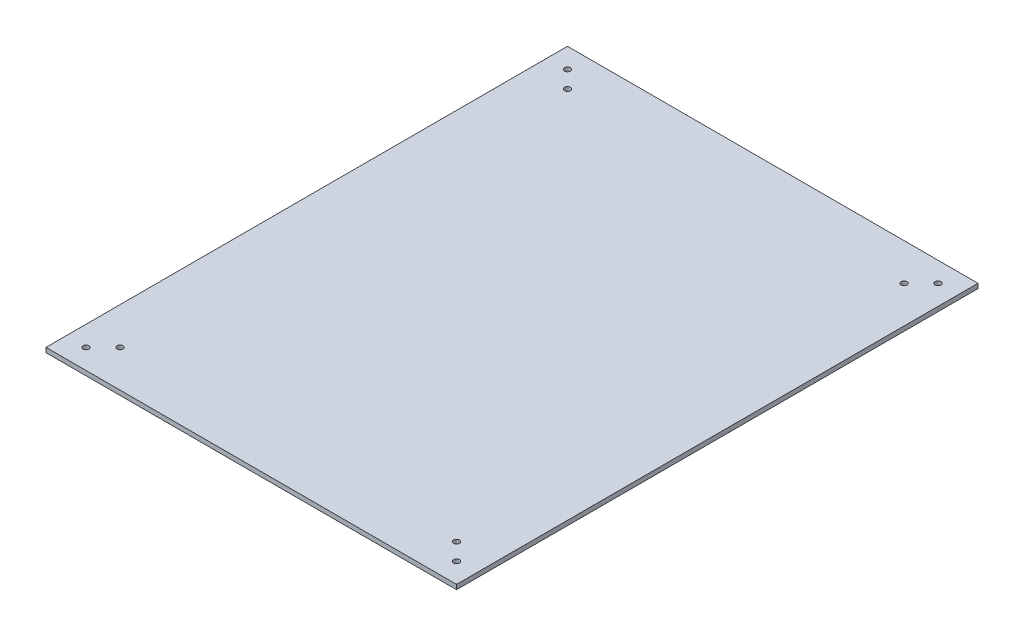
ISO-10303-21;
HEADER;
FILE_DESCRIPTION(('STEP AP214'),'2;1');
FILE_NAME('part.step','',(''),(''),'','','');
FILE_SCHEMA(('AUTOMOTIVE_DESIGN { 1 0 10303 214 1 1 1 1 }'));
ENDSEC;
DATA;
#1=APPLICATION_CONTEXT('core data for automotive mechanical design processes');
#2=APPLICATION_PROTOCOL_DEFINITION('international standard','automotive_design',2000,#1);
#3=PRODUCT_CONTEXT('',#1,'mechanical');
#4=PRODUCT('Part','Part','',(#3));
#5=PRODUCT_RELATED_PRODUCT_CATEGORY('part','',(#4));
#6=PRODUCT_DEFINITION_FORMATION('','',#4);
#7=PRODUCT_DEFINITION_CONTEXT('part definition',#1,'design');
#8=PRODUCT_DEFINITION('design','',#6,#7);
#9=PRODUCT_DEFINITION_SHAPE('','',#8);
#10=(LENGTH_UNIT() NAMED_UNIT(*) SI_UNIT(.MILLI.,.METRE.));
#11=(NAMED_UNIT(*) PLANE_ANGLE_UNIT() SI_UNIT($,.RADIAN.));
#12=(NAMED_UNIT(*) SI_UNIT($,.STERADIAN.) SOLID_ANGLE_UNIT());
#13=UNCERTAINTY_MEASURE_WITH_UNIT(LENGTH_MEASURE(1.E-05),#10,'distance_accuracy_value','');
#14=(GEOMETRIC_REPRESENTATION_CONTEXT(3) GLOBAL_UNCERTAINTY_ASSIGNED_CONTEXT((#13)) GLOBAL_UNIT_ASSIGNED_CONTEXT((#10,
#11,#12)) REPRESENTATION_CONTEXT('',''));
#15=CARTESIAN_POINT('',(0.,0.,0.));
#16=DIRECTION('',(0.,0.,1.));
#17=DIRECTION('',(1.,0.,0.));
#18=AXIS2_PLACEMENT_3D('',#15,#16,#17);
#19=CARTESIAN_POINT('',(0.,2.5,0.));
#20=DIRECTION('',(0.,1.,0.));
#21=DIRECTION('',(0.,0.,1.));
#22=AXIS2_PLACEMENT_3D('',#19,#20,#21);
#23=PLANE('',#22);
#24=CARTESIAN_POINT('',(-91.,2.5,121.));
#25=DIRECTION('',(0.,1.,0.));
#26=DIRECTION('',(0.,0.,1.));
#27=AXIS2_PLACEMENT_3D('',#24,#25,#26);
#28=CIRCLE('',#27,1.6);
#29=CARTESIAN_POINT('',(-91.,2.5,122.6));
#30=VERTEX_POINT('',#29);
#31=EDGE_CURVE('E144',#30,#30,#28,.T.);
#32=ORIENTED_EDGE('',*,*,#31,.F.);
#33=EDGE_LOOP('',(#32));
#34=FACE_BOUND('',#33,.T.);
#35=CARTESIAN_POINT('',(-91.,2.5,-121.));
#36=DIRECTION('',(0.,1.,0.));
#37=DIRECTION('',(0.,0.,1.));
#38=AXIS2_PLACEMENT_3D('',#35,#36,#37);
#39=CIRCLE('',#38,1.60000000000001);
#40=CARTESIAN_POINT('',(-91.,2.5,-119.4));
#41=VERTEX_POINT('',#40);
#42=EDGE_CURVE('E132',#41,#41,#39,.T.);
#43=ORIENTED_EDGE('',*,*,#42,.F.);
#44=EDGE_LOOP('',(#43));
#45=FACE_BOUND('',#44,.T.);
#46=CARTESIAN_POINT('',(-100.18198051534,2.5,130.181980515339));
#47=DIRECTION('',(0.,1.,0.));
#48=DIRECTION('',(0.,0.,1.));
#49=AXIS2_PLACEMENT_3D('',#46,#47,#48);
#50=CIRCLE('',#49,1.6);
#51=CARTESIAN_POINT('',(-100.18198051534,2.5,131.781980515339));
#52=VERTEX_POINT('',#51);
#53=EDGE_CURVE('E120',#52,#52,#50,.T.);
#54=ORIENTED_EDGE('',*,*,#53,.F.);
#55=EDGE_LOOP('',(#54));
#56=FACE_BOUND('',#55,.T.);
#57=CARTESIAN_POINT('',(-100.181980515339,2.5,-130.18198051534));
#58=DIRECTION('',(0.,1.,0.));
#59=DIRECTION('',(0.,0.,1.));
#60=AXIS2_PLACEMENT_3D('',#57,#58,#59);
#61=CIRCLE('',#60,1.6);
#62=CARTESIAN_POINT('',(-100.181980515339,2.5,-128.58198051534));
#63=VERTEX_POINT('',#62);
#64=EDGE_CURVE('E99',#63,#63,#61,.T.);
#65=ORIENTED_EDGE('',*,*,#64,.F.);
#66=EDGE_LOOP('',(#65));
#67=FACE_BOUND('',#66,.T.);
#68=DIRECTION('',(0.,0.,1.));
#69=VECTOR('',#68,1.);
#70=CARTESIAN_POINT('',(-111.,2.5,-141.));
#71=LINE('',#70,#69);
#72=CARTESIAN_POINT('',(-111.,2.5,-141.));
#73=VERTEX_POINT('',#72);
#74=CARTESIAN_POINT('',(-111.,2.5,141.));
#75=VERTEX_POINT('',#74);
#76=EDGE_CURVE('E84',#73,#75,#71,.T.);
#77=ORIENTED_EDGE('',*,*,#76,.T.);
#78=DIRECTION('',(1.,0.,0.));
#79=VECTOR('',#78,1.);
#80=CARTESIAN_POINT('',(-111.,2.5,141.));
#81=LINE('',#80,#79);
#82=CARTESIAN_POINT('',(111.,2.5,141.));
#83=VERTEX_POINT('',#82);
#84=EDGE_CURVE('E79',#75,#83,#81,.T.);
#85=ORIENTED_EDGE('',*,*,#84,.T.);
#86=DIRECTION('',(0.,0.,-1.));
#87=VECTOR('',#86,1.);
#88=CARTESIAN_POINT('',(111.,2.5,-141.));
#89=LINE('',#88,#87);
#90=CARTESIAN_POINT('',(111.,2.5,-141.));
#91=VERTEX_POINT('',#90);
#92=EDGE_CURVE('E82',#83,#91,#89,.T.);
#93=ORIENTED_EDGE('',*,*,#92,.T.);
#94=DIRECTION('',(-1.,0.,0.));
#95=VECTOR('',#94,1.);
#96=CARTESIAN_POINT('',(-111.,2.5,-141.));
#97=LINE('',#96,#95);
#98=EDGE_CURVE('E49',#91,#73,#97,.T.);
#99=ORIENTED_EDGE('',*,*,#98,.T.);
#100=EDGE_LOOP('',(#77,#85,#93,#99));
#101=FACE_BOUND('',#100,.T.);
#102=CARTESIAN_POINT('',(100.18198051534,2.5,-130.181980515339));
#103=DIRECTION('',(0.,1.,0.));
#104=DIRECTION('',(0.,0.,1.));
#105=AXIS2_PLACEMENT_3D('',#102,#103,#104);
#106=CIRCLE('',#105,1.60000000000001);
#107=CARTESIAN_POINT('',(100.18198051534,2.5,-128.581980515339));
#108=VERTEX_POINT('',#107);
#109=EDGE_CURVE('E114',#108,#108,#106,.T.);
#110=ORIENTED_EDGE('',*,*,#109,.F.);
#111=EDGE_LOOP('',(#110));
#112=FACE_BOUND('',#111,.T.);
#113=CARTESIAN_POINT('',(100.181980515339,2.5,130.181980515339));
#114=DIRECTION('',(0.,1.,0.));
#115=DIRECTION('',(0.,0.,1.));
#116=AXIS2_PLACEMENT_3D('',#113,#114,#115);
#117=CIRCLE('',#116,1.6);
#118=CARTESIAN_POINT('',(100.181980515339,2.5,131.781980515339));
#119=VERTEX_POINT('',#118);
#120=EDGE_CURVE('E126',#119,#119,#117,.T.);
#121=ORIENTED_EDGE('',*,*,#120,.F.);
#122=EDGE_LOOP('',(#121));
#123=FACE_BOUND('',#122,.T.);
#124=CARTESIAN_POINT('',(91.,2.5,-121.));
#125=DIRECTION('',(0.,1.,0.));
#126=DIRECTION('',(0.,0.,1.));
#127=AXIS2_PLACEMENT_3D('',#124,#125,#126);
#128=CIRCLE('',#127,1.60000000000001);
#129=CARTESIAN_POINT('',(91.,2.5,-119.4));
#130=VERTEX_POINT('',#129);
#131=EDGE_CURVE('E138',#130,#130,#128,.T.);
#132=ORIENTED_EDGE('',*,*,#131,.F.);
#133=EDGE_LOOP('',(#132));
#134=FACE_BOUND('',#133,.T.);
#135=CARTESIAN_POINT('',(91.,2.5,121.));
#136=DIRECTION('',(0.,1.,0.));
#137=DIRECTION('',(0.,0.,1.));
#138=AXIS2_PLACEMENT_3D('',#135,#136,#137);
#139=CIRCLE('',#138,1.6);
#140=CARTESIAN_POINT('',(91.,2.5,122.6));
#141=VERTEX_POINT('',#140);
#142=EDGE_CURVE('E150',#141,#141,#139,.T.);
#143=ORIENTED_EDGE('',*,*,#142,.F.);
#144=EDGE_LOOP('',(#143));
#145=FACE_BOUND('',#144,.T.);
#146=ADVANCED_FACE('F32',(#34,#45,#56,#67,#101,#112,#123,#134,#145),#23,.T.);
#147=CARTESIAN_POINT('',(0.,0.,0.));
#148=DIRECTION('',(0.,1.,0.));
#149=DIRECTION('',(0.,0.,1.));
#150=AXIS2_PLACEMENT_3D('',#147,#148,#149);
#151=PLANE('',#150);
#152=DIRECTION('',(0.,0.,1.));
#153=VECTOR('',#152,1.);
#154=CARTESIAN_POINT('',(-111.,0.,-141.));
#155=LINE('',#154,#153);
#156=CARTESIAN_POINT('',(-111.,0.,-141.));
#157=VERTEX_POINT('',#156);
#158=CARTESIAN_POINT('',(-111.,0.,141.));
#159=VERTEX_POINT('',#158);
#160=EDGE_CURVE('E96',#157,#159,#155,.T.);
#161=ORIENTED_EDGE('',*,*,#160,.F.);
#162=DIRECTION('',(-1.,0.,0.));
#163=VECTOR('',#162,1.);
#164=CARTESIAN_POINT('',(-111.,0.,-141.));
#165=LINE('',#164,#163);
#166=CARTESIAN_POINT('',(111.,0.,-141.));
#167=VERTEX_POINT('',#166);
#168=EDGE_CURVE('E72',#167,#157,#165,.T.);
#169=ORIENTED_EDGE('',*,*,#168,.F.);
#170=DIRECTION('',(0.,0.,-1.));
#171=VECTOR('',#170,1.);
#172=CARTESIAN_POINT('',(111.,0.,-141.));
#173=LINE('',#172,#171);
#174=CARTESIAN_POINT('',(111.,0.,141.));
#175=VERTEX_POINT('',#174);
#176=EDGE_CURVE('E66',#175,#167,#173,.T.);
#177=ORIENTED_EDGE('',*,*,#176,.F.);
#178=DIRECTION('',(1.,0.,0.));
#179=VECTOR('',#178,1.);
#180=CARTESIAN_POINT('',(-111.,0.,141.));
#181=LINE('',#180,#179);
#182=EDGE_CURVE('E88',#159,#175,#181,.T.);
#183=ORIENTED_EDGE('',*,*,#182,.F.);
#184=EDGE_LOOP('',(#161,#169,#177,#183));
#185=FACE_BOUND('',#184,.T.);
#186=CARTESIAN_POINT('',(-100.181980515339,0.,-130.18198051534));
#187=DIRECTION('',(0.,1.,0.));
#188=DIRECTION('',(0.,0.,1.));
#189=AXIS2_PLACEMENT_3D('',#186,#187,#188);
#190=CIRCLE('',#189,1.6);
#191=CARTESIAN_POINT('',(-100.181980515339,0.,-128.58198051534));
#192=VERTEX_POINT('',#191);
#193=EDGE_CURVE('E111',#192,#192,#190,.T.);
#194=ORIENTED_EDGE('',*,*,#193,.T.);
#195=EDGE_LOOP('',(#194));
#196=FACE_BOUND('',#195,.T.);
#197=CARTESIAN_POINT('',(100.18198051534,0.,-130.181980515339));
#198=DIRECTION('',(0.,1.,0.));
#199=DIRECTION('',(0.,0.,1.));
#200=AXIS2_PLACEMENT_3D('',#197,#198,#199);
#201=CIRCLE('',#200,1.60000000000001);
#202=CARTESIAN_POINT('',(100.18198051534,0.,-128.581980515339));
#203=VERTEX_POINT('',#202);
#204=EDGE_CURVE('E117',#203,#203,#201,.T.);
#205=ORIENTED_EDGE('',*,*,#204,.T.);
#206=EDGE_LOOP('',(#205));
#207=FACE_BOUND('',#206,.T.);
#208=CARTESIAN_POINT('',(-100.18198051534,0.,130.181980515339));
#209=DIRECTION('',(0.,1.,0.));
#210=DIRECTION('',(0.,0.,1.));
#211=AXIS2_PLACEMENT_3D('',#208,#209,#210);
#212=CIRCLE('',#211,1.6);
#213=CARTESIAN_POINT('',(-100.18198051534,0.,131.781980515339));
#214=VERTEX_POINT('',#213);
#215=EDGE_CURVE('E123',#214,#214,#212,.T.);
#216=ORIENTED_EDGE('',*,*,#215,.T.);
#217=EDGE_LOOP('',(#216));
#218=FACE_BOUND('',#217,.T.);
#219=CARTESIAN_POINT('',(100.181980515339,0.,130.181980515339));
#220=DIRECTION('',(0.,1.,0.));
#221=DIRECTION('',(0.,0.,1.));
#222=AXIS2_PLACEMENT_3D('',#219,#220,#221);
#223=CIRCLE('',#222,1.6);
#224=CARTESIAN_POINT('',(100.181980515339,0.,131.781980515339));
#225=VERTEX_POINT('',#224);
#226=EDGE_CURVE('E129',#225,#225,#223,.T.);
#227=ORIENTED_EDGE('',*,*,#226,.T.);
#228=EDGE_LOOP('',(#227));
#229=FACE_BOUND('',#228,.T.);
#230=CARTESIAN_POINT('',(-91.,0.,-121.));
#231=DIRECTION('',(0.,1.,0.));
#232=DIRECTION('',(0.,0.,1.));
#233=AXIS2_PLACEMENT_3D('',#230,#231,#232);
#234=CIRCLE('',#233,1.60000000000001);
#235=CARTESIAN_POINT('',(-91.,0.,-119.4));
#236=VERTEX_POINT('',#235);
#237=EDGE_CURVE('E135',#236,#236,#234,.T.);
#238=ORIENTED_EDGE('',*,*,#237,.T.);
#239=EDGE_LOOP('',(#238));
#240=FACE_BOUND('',#239,.T.);
#241=CARTESIAN_POINT('',(91.,0.,-121.));
#242=DIRECTION('',(0.,1.,0.));
#243=DIRECTION('',(0.,0.,1.));
#244=AXIS2_PLACEMENT_3D('',#241,#242,#243);
#245=CIRCLE('',#244,1.60000000000001);
#246=CARTESIAN_POINT('',(91.,0.,-119.4));
#247=VERTEX_POINT('',#246);
#248=EDGE_CURVE('E141',#247,#247,#245,.T.);
#249=ORIENTED_EDGE('',*,*,#248,.T.);
#250=EDGE_LOOP('',(#249));
#251=FACE_BOUND('',#250,.T.);
#252=CARTESIAN_POINT('',(-91.,0.,121.));
#253=DIRECTION('',(0.,1.,0.));
#254=DIRECTION('',(0.,0.,1.));
#255=AXIS2_PLACEMENT_3D('',#252,#253,#254);
#256=CIRCLE('',#255,1.6);
#257=CARTESIAN_POINT('',(-91.,0.,122.6));
#258=VERTEX_POINT('',#257);
#259=EDGE_CURVE('E147',#258,#258,#256,.T.);
#260=ORIENTED_EDGE('',*,*,#259,.T.);
#261=EDGE_LOOP('',(#260));
#262=FACE_BOUND('',#261,.T.);
#263=CARTESIAN_POINT('',(91.,0.,121.));
#264=DIRECTION('',(0.,1.,0.));
#265=DIRECTION('',(0.,0.,1.));
#266=AXIS2_PLACEMENT_3D('',#263,#264,#265);
#267=CIRCLE('',#266,1.6);
#268=CARTESIAN_POINT('',(91.,0.,122.6));
#269=VERTEX_POINT('',#268);
#270=EDGE_CURVE('E153',#269,#269,#267,.T.);
#271=ORIENTED_EDGE('',*,*,#270,.T.);
#272=EDGE_LOOP('',(#271));
#273=FACE_BOUND('',#272,.T.);
#274=ADVANCED_FACE('F107',(#185,#196,#207,#218,#229,#240,#251,#262,#273),#151,.F.);
#275=CARTESIAN_POINT('',(-111.,2.5,-141.));
#276=DIRECTION('',(1.,0.,0.));
#277=DIRECTION('',(0.,0.,-1.));
#278=AXIS2_PLACEMENT_3D('',#275,#276,#277);
#279=PLANE('',#278);
#280=ORIENTED_EDGE('',*,*,#160,.T.);
#281=DIRECTION('',(0.,-1.,0.));
#282=VECTOR('',#281,1.);
#283=CARTESIAN_POINT('',(-111.,2.5,141.));
#284=LINE('',#283,#282);
#285=EDGE_CURVE('E11',#75,#159,#284,.T.);
#286=ORIENTED_EDGE('',*,*,#285,.F.);
#287=ORIENTED_EDGE('',*,*,#76,.F.);
#288=DIRECTION('',(0.,-1.,0.));
#289=VECTOR('',#288,1.);
#290=CARTESIAN_POINT('',(-111.,2.5,-141.));
#291=LINE('',#290,#289);
#292=EDGE_CURVE('E92',#73,#157,#291,.T.);
#293=ORIENTED_EDGE('',*,*,#292,.T.);
#294=EDGE_LOOP('',(#280,#286,#287,#293));
#295=FACE_BOUND('',#294,.T.);
#296=ADVANCED_FACE('F34',(#295),#279,.F.);
#297=CARTESIAN_POINT('',(-111.,2.5,141.));
#298=DIRECTION('',(0.,0.,-1.));
#299=DIRECTION('',(-1.,0.,0.));
#300=AXIS2_PLACEMENT_3D('',#297,#298,#299);
#301=PLANE('',#300);
#302=ORIENTED_EDGE('',*,*,#182,.T.);
#303=DIRECTION('',(0.,-1.,0.));
#304=VECTOR('',#303,1.);
#305=CARTESIAN_POINT('',(111.,2.5,141.));
#306=LINE('',#305,#304);
#307=EDGE_CURVE('E41',#83,#175,#306,.T.);
#308=ORIENTED_EDGE('',*,*,#307,.F.);
#309=ORIENTED_EDGE('',*,*,#84,.F.);
#310=ORIENTED_EDGE('',*,*,#285,.T.);
#311=EDGE_LOOP('',(#302,#308,#309,#310));
#312=FACE_BOUND('',#311,.T.);
#313=ADVANCED_FACE('F87',(#312),#301,.F.);
#314=CARTESIAN_POINT('',(111.,2.5,-141.));
#315=DIRECTION('',(-1.,0.,0.));
#316=DIRECTION('',(0.,0.,1.));
#317=AXIS2_PLACEMENT_3D('',#314,#315,#316);
#318=PLANE('',#317);
#319=ORIENTED_EDGE('',*,*,#176,.T.);
#320=DIRECTION('',(0.,-1.,0.));
#321=VECTOR('',#320,1.);
#322=CARTESIAN_POINT('',(111.,2.5,-141.));
#323=LINE('',#322,#321);
#324=EDGE_CURVE('E89',#91,#167,#323,.T.);
#325=ORIENTED_EDGE('',*,*,#324,.F.);
#326=ORIENTED_EDGE('',*,*,#92,.F.);
#327=ORIENTED_EDGE('',*,*,#307,.T.);
#328=EDGE_LOOP('',(#319,#325,#326,#327));
#329=FACE_BOUND('',#328,.T.);
#330=ADVANCED_FACE('F90',(#329),#318,.F.);
#331=CARTESIAN_POINT('',(-111.,2.5,-141.));
#332=DIRECTION('',(0.,0.,1.));
#333=DIRECTION('',(1.,0.,0.));
#334=AXIS2_PLACEMENT_3D('',#331,#332,#333);
#335=PLANE('',#334);
#336=ORIENTED_EDGE('',*,*,#168,.T.);
#337=ORIENTED_EDGE('',*,*,#292,.F.);
#338=ORIENTED_EDGE('',*,*,#98,.F.);
#339=ORIENTED_EDGE('',*,*,#324,.T.);
#340=EDGE_LOOP('',(#336,#337,#338,#339));
#341=FACE_BOUND('',#340,.T.);
#342=ADVANCED_FACE('F104',(#341),#335,.F.);
#343=CARTESIAN_POINT('',(-100.181980515339,2.5,-130.18198051534));
#344=DIRECTION('',(0.,-1.,0.));
#345=DIRECTION('',(0.,0.,-1.));
#346=AXIS2_PLACEMENT_3D('',#343,#344,#345);
#347=CYLINDRICAL_SURFACE('',#346,1.6);
#348=ORIENTED_EDGE('',*,*,#64,.T.);
#349=EDGE_LOOP('',(#348));
#350=FACE_BOUND('',#349,.T.);
#351=ORIENTED_EDGE('',*,*,#193,.F.);
#352=EDGE_LOOP('',(#351));
#353=FACE_BOUND('',#352,.T.);
#354=ADVANCED_FACE('F172',(#350,#353),#347,.F.);
#355=CARTESIAN_POINT('',(100.18198051534,2.5,-130.181980515339));
#356=DIRECTION('',(0.,-1.,0.));
#357=DIRECTION('',(0.,0.,-1.));
#358=AXIS2_PLACEMENT_3D('',#355,#356,#357);
#359=CYLINDRICAL_SURFACE('',#358,1.60000000000001);
#360=ORIENTED_EDGE('',*,*,#109,.T.);
#361=EDGE_LOOP('',(#360));
#362=FACE_BOUND('',#361,.T.);
#363=ORIENTED_EDGE('',*,*,#204,.F.);
#364=EDGE_LOOP('',(#363));
#365=FACE_BOUND('',#364,.T.);
#366=ADVANCED_FACE('F218',(#362,#365),#359,.F.);
#367=CARTESIAN_POINT('',(-100.18198051534,2.5,130.181980515339));
#368=DIRECTION('',(0.,-1.,0.));
#369=DIRECTION('',(0.,0.,-1.));
#370=AXIS2_PLACEMENT_3D('',#367,#368,#369);
#371=CYLINDRICAL_SURFACE('',#370,1.6);
#372=ORIENTED_EDGE('',*,*,#53,.T.);
#373=EDGE_LOOP('',(#372));
#374=FACE_BOUND('',#373,.T.);
#375=ORIENTED_EDGE('',*,*,#215,.F.);
#376=EDGE_LOOP('',(#375));
#377=FACE_BOUND('',#376,.T.);
#378=ADVANCED_FACE('F226',(#374,#377),#371,.F.);
#379=CARTESIAN_POINT('',(100.181980515339,2.5,130.181980515339));
#380=DIRECTION('',(0.,-1.,0.));
#381=DIRECTION('',(0.,0.,-1.));
#382=AXIS2_PLACEMENT_3D('',#379,#380,#381);
#383=CYLINDRICAL_SURFACE('',#382,1.6);
#384=ORIENTED_EDGE('',*,*,#120,.T.);
#385=EDGE_LOOP('',(#384));
#386=FACE_BOUND('',#385,.T.);
#387=ORIENTED_EDGE('',*,*,#226,.F.);
#388=EDGE_LOOP('',(#387));
#389=FACE_BOUND('',#388,.T.);
#390=ADVANCED_FACE('F234',(#386,#389),#383,.F.);
#391=CARTESIAN_POINT('',(-91.,2.5,-121.));
#392=DIRECTION('',(0.,-1.,0.));
#393=DIRECTION('',(0.,0.,-1.));
#394=AXIS2_PLACEMENT_3D('',#391,#392,#393);
#395=CYLINDRICAL_SURFACE('',#394,1.60000000000001);
#396=ORIENTED_EDGE('',*,*,#42,.T.);
#397=EDGE_LOOP('',(#396));
#398=FACE_BOUND('',#397,.T.);
#399=ORIENTED_EDGE('',*,*,#237,.F.);
#400=EDGE_LOOP('',(#399));
#401=FACE_BOUND('',#400,.T.);
#402=ADVANCED_FACE('F243',(#398,#401),#395,.F.);
#403=CARTESIAN_POINT('',(91.,2.5,-121.));
#404=DIRECTION('',(0.,-1.,0.));
#405=DIRECTION('',(0.,0.,-1.));
#406=AXIS2_PLACEMENT_3D('',#403,#404,#405);
#407=CYLINDRICAL_SURFACE('',#406,1.60000000000001);
#408=ORIENTED_EDGE('',*,*,#131,.T.);
#409=EDGE_LOOP('',(#408));
#410=FACE_BOUND('',#409,.T.);
#411=ORIENTED_EDGE('',*,*,#248,.F.);
#412=EDGE_LOOP('',(#411));
#413=FACE_BOUND('',#412,.T.);
#414=ADVANCED_FACE('F252',(#410,#413),#407,.F.);
#415=CARTESIAN_POINT('',(-91.,2.5,121.));
#416=DIRECTION('',(0.,-1.,0.));
#417=DIRECTION('',(0.,0.,-1.));
#418=AXIS2_PLACEMENT_3D('',#415,#416,#417);
#419=CYLINDRICAL_SURFACE('',#418,1.6);
#420=ORIENTED_EDGE('',*,*,#31,.T.);
#421=EDGE_LOOP('',(#420));
#422=FACE_BOUND('',#421,.T.);
#423=ORIENTED_EDGE('',*,*,#259,.F.);
#424=EDGE_LOOP('',(#423));
#425=FACE_BOUND('',#424,.T.);
#426=ADVANCED_FACE('F261',(#422,#425),#419,.F.);
#427=CARTESIAN_POINT('',(91.,2.5,121.));
#428=DIRECTION('',(0.,-1.,0.));
#429=DIRECTION('',(0.,0.,-1.));
#430=AXIS2_PLACEMENT_3D('',#427,#428,#429);
#431=CYLINDRICAL_SURFACE('',#430,1.6);
#432=ORIENTED_EDGE('',*,*,#142,.T.);
#433=EDGE_LOOP('',(#432));
#434=FACE_BOUND('',#433,.T.);
#435=ORIENTED_EDGE('',*,*,#270,.F.);
#436=EDGE_LOOP('',(#435));
#437=FACE_BOUND('',#436,.T.);
#438=ADVANCED_FACE('F159',(#434,#437),#431,.F.);
#439=CLOSED_SHELL('',(#146,#274,#296,#313,#330,#342,#354,#366,#378,#390,#402,#414,#426,#438));
#440=MANIFOLD_SOLID_BREP('B2',#439);
#441=ADVANCED_BREP_SHAPE_REPRESENTATION('',(#18,#440),#14);
#442=SHAPE_DEFINITION_REPRESENTATION(#9,#441);
ENDSEC;
END-ISO-10303-21;
